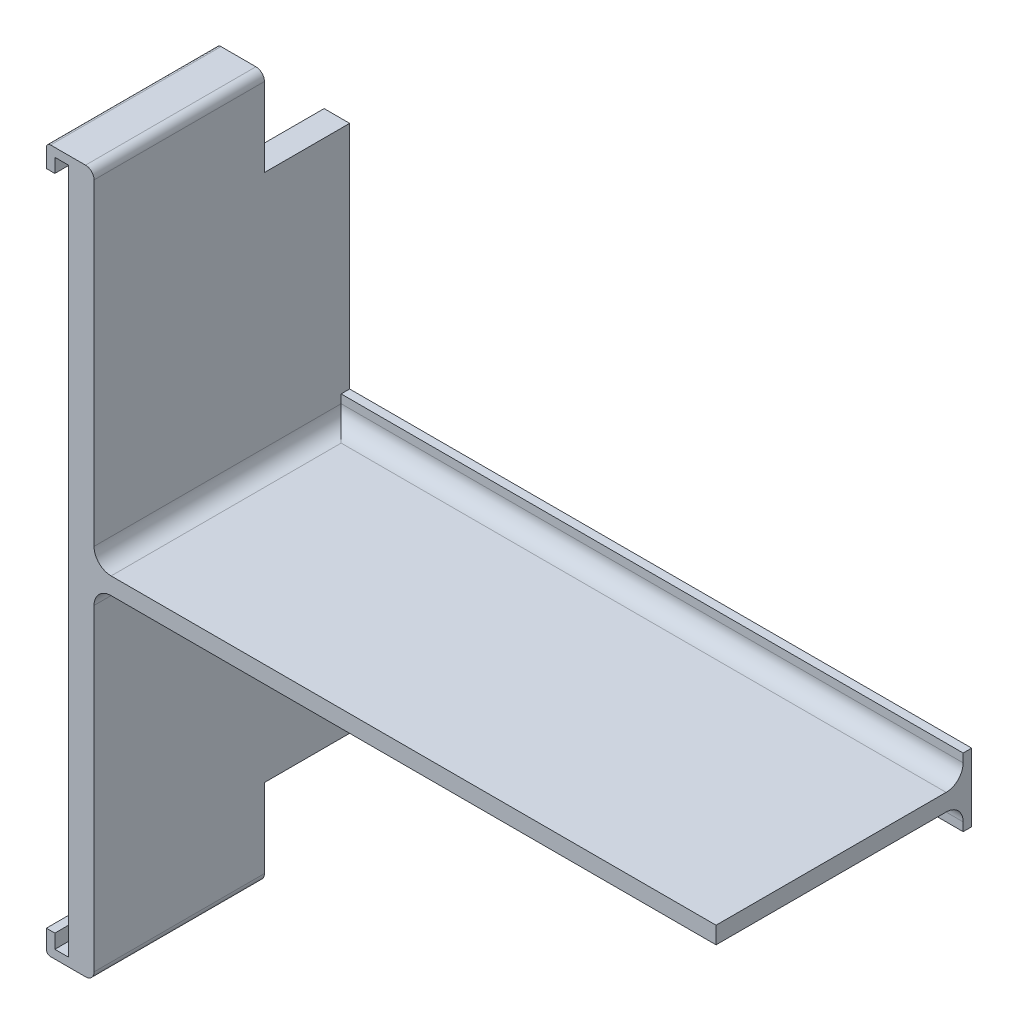
ISO-10303-21;
HEADER;
FILE_DESCRIPTION(('STEP AP214'),'2;1');
FILE_NAME('part.step','',(''),(''),'','','');
FILE_SCHEMA(('AUTOMOTIVE_DESIGN { 1 0 10303 214 1 1 1 1 }'));
ENDSEC;
DATA;
#1=APPLICATION_CONTEXT('core data for automotive mechanical design processes');
#2=APPLICATION_PROTOCOL_DEFINITION('international standard','automotive_design',2000,#1);
#3=PRODUCT_CONTEXT('',#1,'mechanical');
#4=PRODUCT('Part','Part','',(#3));
#5=PRODUCT_RELATED_PRODUCT_CATEGORY('part','',(#4));
#6=PRODUCT_DEFINITION_FORMATION('','',#4);
#7=PRODUCT_DEFINITION_CONTEXT('part definition',#1,'design');
#8=PRODUCT_DEFINITION('design','',#6,#7);
#9=PRODUCT_DEFINITION_SHAPE('','',#8);
#10=(LENGTH_UNIT() NAMED_UNIT(*) SI_UNIT(.MILLI.,.METRE.));
#11=(NAMED_UNIT(*) PLANE_ANGLE_UNIT() SI_UNIT($,.RADIAN.));
#12=(NAMED_UNIT(*) SI_UNIT($,.STERADIAN.) SOLID_ANGLE_UNIT());
#13=UNCERTAINTY_MEASURE_WITH_UNIT(LENGTH_MEASURE(1.E-05),#10,'distance_accuracy_value','');
#14=(GEOMETRIC_REPRESENTATION_CONTEXT(3) GLOBAL_UNCERTAINTY_ASSIGNED_CONTEXT((#13)) GLOBAL_UNIT_ASSIGNED_CONTEXT((#10,
#11,#12)) REPRESENTATION_CONTEXT('',''));
#15=CARTESIAN_POINT('',(0.,0.,0.));
#16=DIRECTION('',(0.,0.,1.));
#17=DIRECTION('',(1.,0.,0.));
#18=AXIS2_PLACEMENT_3D('',#15,#16,#17);
#19=CARTESIAN_POINT('',(0.8,1.,-10.));
#20=DIRECTION('',(0.,1.,0.));
#21=DIRECTION('',(0.,0.,1.));
#22=AXIS2_PLACEMENT_3D('',#19,#20,#21);
#23=PLANE('',#22);
#24=DIRECTION('',(0.,0.,1.));
#25=VECTOR('',#24,1.);
#26=CARTESIAN_POINT('',(76.8,1.,-10.));
#27=LINE('',#26,#25);
#28=CARTESIAN_POINT('',(76.8,1.,-7.));
#29=VERTEX_POINT('',#28);
#30=CARTESIAN_POINT('',(76.8,1.,20.));
#31=VERTEX_POINT('',#30);
#32=EDGE_CURVE('E329',#29,#31,#27,.T.);
#33=ORIENTED_EDGE('',*,*,#32,.F.);
#34=DIRECTION('',(-1.,0.,0.));
#35=VECTOR('',#34,1.);
#36=CARTESIAN_POINT('',(0.8,1.,-7.));
#37=LINE('',#36,#35);
#38=CARTESIAN_POINT('',(5.8,1.,-7.));
#39=VERTEX_POINT('',#38);
#40=EDGE_CURVE('E469',#29,#39,#37,.T.);
#41=ORIENTED_EDGE('',*,*,#40,.T.);
#42=DIRECTION('',(0.,0.,-1.));
#43=VECTOR('',#42,1.);
#44=CARTESIAN_POINT('',(5.8,1.,-10.));
#45=LINE('',#44,#43);
#46=CARTESIAN_POINT('',(5.8,1.,20.));
#47=VERTEX_POINT('',#46);
#48=EDGE_CURVE('E467',#39,#47,#45,.F.);
#49=ORIENTED_EDGE('',*,*,#48,.T.);
#50=DIRECTION('',(-1.,0.,0.));
#51=VECTOR('',#50,1.);
#52=CARTESIAN_POINT('',(0.8,1.,20.));
#53=LINE('',#52,#51);
#54=EDGE_CURVE('E321',#31,#47,#53,.T.);
#55=ORIENTED_EDGE('',*,*,#54,.F.);
#56=EDGE_LOOP('',(#33,#41,#49,#55));
#57=FACE_BOUND('',#56,.T.);
#58=ADVANCED_FACE('F43',(#57),#23,.T.);
#59=CARTESIAN_POINT('',(0.8,-1.,-10.));
#60=DIRECTION('',(0.,-1.,0.));
#61=DIRECTION('',(0.,0.,-1.));
#62=AXIS2_PLACEMENT_3D('',#59,#60,#61);
#63=PLANE('',#62);
#64=DIRECTION('',(1.,0.,0.));
#65=VECTOR('',#64,1.);
#66=CARTESIAN_POINT('',(0.8,-1.,20.));
#67=LINE('',#66,#65);
#68=CARTESIAN_POINT('',(5.8,-1.,20.));
#69=VERTEX_POINT('',#68);
#70=CARTESIAN_POINT('',(76.8,-1.,20.));
#71=VERTEX_POINT('',#70);
#72=EDGE_CURVE('E304',#69,#71,#67,.T.);
#73=ORIENTED_EDGE('',*,*,#72,.F.);
#74=DIRECTION('',(0.,0.,1.));
#75=VECTOR('',#74,1.);
#76=CARTESIAN_POINT('',(5.8,-1.,-10.));
#77=LINE('',#76,#75);
#78=CARTESIAN_POINT('',(5.8,-1.,-7.));
#79=VERTEX_POINT('',#78);
#80=EDGE_CURVE('E463',#69,#79,#77,.F.);
#81=ORIENTED_EDGE('',*,*,#80,.T.);
#82=DIRECTION('',(1.,0.,0.));
#83=VECTOR('',#82,1.);
#84=CARTESIAN_POINT('',(0.8,-1.,-7.));
#85=LINE('',#84,#83);
#86=CARTESIAN_POINT('',(76.8,-1.,-7.));
#87=VERTEX_POINT('',#86);
#88=EDGE_CURVE('E461',#79,#87,#85,.T.);
#89=ORIENTED_EDGE('',*,*,#88,.T.);
#90=DIRECTION('',(0.,0.,1.));
#91=VECTOR('',#90,1.);
#92=CARTESIAN_POINT('',(76.8,-1.,-10.));
#93=LINE('',#92,#91);
#94=EDGE_CURVE('E323',#87,#71,#93,.T.);
#95=ORIENTED_EDGE('',*,*,#94,.T.);
#96=EDGE_LOOP('',(#73,#81,#89,#95));
#97=FACE_BOUND('',#96,.T.);
#98=ADVANCED_FACE('F497',(#97),#63,.T.);
#99=CARTESIAN_POINT('',(0.,0.,0.));
#100=DIRECTION('',(0.,0.,1.));
#101=DIRECTION('',(1.,0.,0.));
#102=AXIS2_PLACEMENT_3D('',#99,#100,#101);
#103=PLANE('',#102);
#104=DIRECTION('',(1.,0.,0.));
#105=VECTOR('',#104,1.);
#106=CARTESIAN_POINT('',(0.8,31.,0.));
#107=LINE('',#106,#105);
#108=CARTESIAN_POINT('',(0.8,31.,0.));
#109=VERTEX_POINT('',#108);
#110=CARTESIAN_POINT('',(3.8,31.,0.));
#111=VERTEX_POINT('',#110);
#112=EDGE_CURVE('E296',#109,#111,#107,.T.);
#113=ORIENTED_EDGE('',*,*,#112,.F.);
#114=DIRECTION('',(0.,1.,0.));
#115=VECTOR('',#114,1.);
#116=CARTESIAN_POINT('',(0.8,0.,0.));
#117=LINE('',#116,#115);
#118=CARTESIAN_POINT('',(0.8,40.25,0.));
#119=VERTEX_POINT('',#118);
#120=EDGE_CURVE('E376',#109,#119,#117,.T.);
#121=ORIENTED_EDGE('',*,*,#120,.T.);
#122=DIRECTION('',(-1.,0.,0.));
#123=VECTOR('',#122,1.);
#124=CARTESIAN_POINT('',(0.,40.25,0.));
#125=LINE('',#124,#123);
#126=CARTESIAN_POINT('',(-0.8,40.25,0.));
#127=VERTEX_POINT('',#126);
#128=EDGE_CURVE('E373',#119,#127,#125,.T.);
#129=ORIENTED_EDGE('',*,*,#128,.T.);
#130=DIRECTION('',(0.,1.,0.));
#131=VECTOR('',#130,1.);
#132=CARTESIAN_POINT('',(-0.8,0.,0.));
#133=LINE('',#132,#131);
#134=CARTESIAN_POINT('',(-0.8,38.6034755324663,0.));
#135=VERTEX_POINT('',#134);
#136=EDGE_CURVE('E370',#135,#127,#133,.T.);
#137=ORIENTED_EDGE('',*,*,#136,.F.);
#138=DIRECTION('',(1.,0.,0.));
#139=VECTOR('',#138,1.);
#140=CARTESIAN_POINT('',(0.,38.6034755324663,0.));
#141=LINE('',#140,#139);
#142=CARTESIAN_POINT('',(-1.8,38.6034755324663,0.));
#143=VERTEX_POINT('',#142);
#144=EDGE_CURVE('E331',#143,#135,#141,.T.);
#145=ORIENTED_EDGE('',*,*,#144,.F.);
#146=DIRECTION('',(0.,1.,0.));
#147=VECTOR('',#146,1.);
#148=CARTESIAN_POINT('',(-1.80000000000001,0.,0.));
#149=LINE('',#148,#147);
#150=CARTESIAN_POINT('',(-1.8,40.75,0.));
#151=VERTEX_POINT('',#150);
#152=EDGE_CURVE('E338',#143,#151,#149,.T.);
#153=ORIENTED_EDGE('',*,*,#152,.T.);
#154=CARTESIAN_POINT('',(-1.3,40.75,0.));
#155=DIRECTION('',(0.,0.,1.));
#156=DIRECTION('',(1.,0.,0.));
#157=AXIS2_PLACEMENT_3D('',#154,#155,#156);
#158=CIRCLE('',#157,0.5);
#159=CARTESIAN_POINT('',(-1.3,41.25,0.));
#160=VERTEX_POINT('',#159);
#161=EDGE_CURVE('E443',#151,#160,#158,.F.);
#162=ORIENTED_EDGE('',*,*,#161,.T.);
#163=DIRECTION('',(-1.,0.,0.));
#164=VECTOR('',#163,1.);
#165=CARTESIAN_POINT('',(0.,41.25,0.));
#166=LINE('',#165,#164);
#167=CARTESIAN_POINT('',(2.8,41.25,0.));
#168=VERTEX_POINT('',#167);
#169=EDGE_CURVE('E396',#168,#160,#166,.T.);
#170=ORIENTED_EDGE('',*,*,#169,.F.);
#171=CARTESIAN_POINT('',(2.8,40.25,0.));
#172=DIRECTION('',(0.,0.,1.));
#173=DIRECTION('',(1.,0.,0.));
#174=AXIS2_PLACEMENT_3D('',#171,#172,#173);
#175=CIRCLE('',#174,1.);
#176=CARTESIAN_POINT('',(3.8,40.25,0.));
#177=VERTEX_POINT('',#176);
#178=EDGE_CURVE('E423',#168,#177,#175,.F.);
#179=ORIENTED_EDGE('',*,*,#178,.T.);
#180=DIRECTION('',(0.,1.,0.));
#181=VECTOR('',#180,1.);
#182=CARTESIAN_POINT('',(3.8,0.,0.));
#183=LINE('',#182,#181);
#184=EDGE_CURVE('E392',#111,#177,#183,.T.);
#185=ORIENTED_EDGE('',*,*,#184,.F.);
#186=EDGE_LOOP('',(#113,#121,#129,#137,#145,#153,#162,#170,#179,#185));
#187=FACE_BOUND('',#186,.T.);
#188=ADVANCED_FACE('F584',(#187),#103,.F.);
#189=DIRECTION('',(-1.,0.,0.));
#190=VECTOR('',#189,1.);
#191=CARTESIAN_POINT('',(0.8,-31.,0.));
#192=LINE('',#191,#190);
#193=CARTESIAN_POINT('',(3.8,-31.,0.));
#194=VERTEX_POINT('',#193);
#195=CARTESIAN_POINT('',(0.8,-31.,0.));
#196=VERTEX_POINT('',#195);
#197=EDGE_CURVE('E291',#194,#196,#192,.T.);
#198=ORIENTED_EDGE('',*,*,#197,.F.);
#199=CARTESIAN_POINT('',(3.8,-40.25,0.));
#200=VERTEX_POINT('',#199);
#201=EDGE_CURVE('E393',#200,#194,#183,.T.);
#202=ORIENTED_EDGE('',*,*,#201,.F.);
#203=CARTESIAN_POINT('',(2.8,-40.25,0.));
#204=DIRECTION('',(0.,0.,1.));
#205=DIRECTION('',(1.,0.,0.));
#206=AXIS2_PLACEMENT_3D('',#203,#204,#205);
#207=CIRCLE('',#206,1.);
#208=CARTESIAN_POINT('',(2.8,-41.25,0.));
#209=VERTEX_POINT('',#208);
#210=EDGE_CURVE('E436',#200,#209,#207,.F.);
#211=ORIENTED_EDGE('',*,*,#210,.T.);
#212=DIRECTION('',(-1.,0.,0.));
#213=VECTOR('',#212,1.);
#214=CARTESIAN_POINT('',(0.,-41.25,0.));
#215=LINE('',#214,#213);
#216=CARTESIAN_POINT('',(-1.3,-41.25,0.));
#217=VERTEX_POINT('',#216);
#218=EDGE_CURVE('E389',#209,#217,#215,.T.);
#219=ORIENTED_EDGE('',*,*,#218,.T.);
#220=CARTESIAN_POINT('',(-1.3,-40.75,0.));
#221=DIRECTION('',(0.,0.,1.));
#222=DIRECTION('',(1.,0.,0.));
#223=AXIS2_PLACEMENT_3D('',#220,#221,#222);
#224=CIRCLE('',#223,0.5);
#225=CARTESIAN_POINT('',(-1.8,-40.75,0.));
#226=VERTEX_POINT('',#225);
#227=EDGE_CURVE('E454',#217,#226,#224,.F.);
#228=ORIENTED_EDGE('',*,*,#227,.T.);
#229=DIRECTION('',(0.,1.,0.));
#230=VECTOR('',#229,1.);
#231=CARTESIAN_POINT('',(-1.80000000000001,0.,0.));
#232=LINE('',#231,#230);
#233=CARTESIAN_POINT('',(-1.8,-38.6034755324663,0.));
#234=VERTEX_POINT('',#233);
#235=EDGE_CURVE('E387',#226,#234,#232,.T.);
#236=ORIENTED_EDGE('',*,*,#235,.T.);
#237=DIRECTION('',(1.,0.,0.));
#238=VECTOR('',#237,1.);
#239=CARTESIAN_POINT('',(0.,-38.6034755324663,0.));
#240=LINE('',#239,#238);
#241=CARTESIAN_POINT('',(-0.8,-38.6034755324663,0.));
#242=VERTEX_POINT('',#241);
#243=EDGE_CURVE('E384',#234,#242,#240,.T.);
#244=ORIENTED_EDGE('',*,*,#243,.T.);
#245=DIRECTION('',(0.,1.,0.));
#246=VECTOR('',#245,1.);
#247=CARTESIAN_POINT('',(-0.8,0.,0.));
#248=LINE('',#247,#246);
#249=CARTESIAN_POINT('',(-0.8,-40.25,0.));
#250=VERTEX_POINT('',#249);
#251=EDGE_CURVE('E381',#250,#242,#248,.T.);
#252=ORIENTED_EDGE('',*,*,#251,.F.);
#253=DIRECTION('',(-1.,0.,0.));
#254=VECTOR('',#253,1.);
#255=CARTESIAN_POINT('',(0.,-40.25,0.));
#256=LINE('',#255,#254);
#257=CARTESIAN_POINT('',(0.8,-40.25,0.));
#258=VERTEX_POINT('',#257);
#259=EDGE_CURVE('E379',#258,#250,#256,.T.);
#260=ORIENTED_EDGE('',*,*,#259,.F.);
#261=EDGE_CURVE('E377',#258,#196,#117,.T.);
#262=ORIENTED_EDGE('',*,*,#261,.T.);
#263=EDGE_LOOP('',(#198,#202,#211,#219,#228,#236,#244,#252,#260,#262));
#264=FACE_BOUND('',#263,.T.);
#265=ADVANCED_FACE('F536',(#264),#103,.F.);
#266=CARTESIAN_POINT('',(3.8,0.,20.));
#267=DIRECTION('',(-1.,0.,0.));
#268=DIRECTION('',(0.,0.,1.));
#269=AXIS2_PLACEMENT_3D('',#266,#267,#268);
#270=PLANE('',#269);
#271=DIRECTION('',(0.,1.,0.));
#272=VECTOR('',#271,1.);
#273=CARTESIAN_POINT('',(3.8,0.,20.));
#274=LINE('',#273,#272);
#275=CARTESIAN_POINT('',(3.8,3.,20.));
#276=VERTEX_POINT('',#275);
#277=CARTESIAN_POINT('',(3.8,40.25,20.));
#278=VERTEX_POINT('',#277);
#279=EDGE_CURVE('E357',#276,#278,#274,.T.);
#280=ORIENTED_EDGE('',*,*,#279,.F.);
#281=DIRECTION('',(0.,0.,-1.));
#282=VECTOR('',#281,1.);
#283=CARTESIAN_POINT('',(3.8,3.,20.));
#284=LINE('',#283,#282);
#285=CARTESIAN_POINT('',(3.8,3.,-9.));
#286=VERTEX_POINT('',#285);
#287=EDGE_CURVE('E65',#276,#286,#284,.T.);
#288=ORIENTED_EDGE('',*,*,#287,.T.);
#289=DIRECTION('',(0.,-1.,0.));
#290=VECTOR('',#289,1.);
#291=CARTESIAN_POINT('',(3.8,0.,-9.));
#292=LINE('',#291,#290);
#293=CARTESIAN_POINT('',(3.8,4.,-9.));
#294=VERTEX_POINT('',#293);
#295=EDGE_CURVE('E288',#294,#286,#292,.T.);
#296=ORIENTED_EDGE('',*,*,#295,.F.);
#297=DIRECTION('',(0.,0.,-1.));
#298=VECTOR('',#297,1.);
#299=CARTESIAN_POINT('',(3.8,4.,20.));
#300=LINE('',#299,#298);
#301=CARTESIAN_POINT('',(3.8,4.,-10.));
#302=VERTEX_POINT('',#301);
#303=EDGE_CURVE('E253',#294,#302,#300,.T.);
#304=ORIENTED_EDGE('',*,*,#303,.T.);
#305=DIRECTION('',(0.,-1.,0.));
#306=VECTOR('',#305,1.);
#307=CARTESIAN_POINT('',(3.8,31.,-9.99999999999999));
#308=LINE('',#307,#306);
#309=CARTESIAN_POINT('',(3.8,31.,-9.99999999999999));
#310=VERTEX_POINT('',#309);
#311=EDGE_CURVE('E301',#310,#302,#308,.T.);
#312=ORIENTED_EDGE('',*,*,#311,.F.);
#313=DIRECTION('',(0.,0.,1.));
#314=VECTOR('',#313,1.);
#315=CARTESIAN_POINT('',(3.8,31.,-72.072538211354));
#316=LINE('',#315,#314);
#317=EDGE_CURVE('E299',#310,#111,#316,.T.);
#318=ORIENTED_EDGE('',*,*,#317,.T.);
#319=ORIENTED_EDGE('',*,*,#184,.T.);
#320=DIRECTION('',(0.,0.,-1.));
#321=VECTOR('',#320,1.);
#322=CARTESIAN_POINT('',(3.8,40.25,20.));
#323=LINE('',#322,#321);
#324=EDGE_CURVE('E426',#177,#278,#323,.F.);
#325=ORIENTED_EDGE('',*,*,#324,.T.);
#326=EDGE_LOOP('',(#280,#288,#296,#304,#312,#318,#319,#325));
#327=FACE_BOUND('',#326,.T.);
#328=ADVANCED_FACE('F520',(#327),#270,.F.);
#329=CARTESIAN_POINT('',(0.,38.6034755324663,20.));
#330=DIRECTION('',(0.,1.,0.));
#331=DIRECTION('',(0.,0.,1.));
#332=AXIS2_PLACEMENT_3D('',#329,#330,#331);
#333=PLANE('',#332);
#334=ORIENTED_EDGE('',*,*,#144,.T.);
#335=DIRECTION('',(0.,0.,-1.));
#336=VECTOR('',#335,1.);
#337=CARTESIAN_POINT('',(-0.8,38.6034755324663,20.));
#338=LINE('',#337,#336);
#339=CARTESIAN_POINT('',(-0.8,38.6034755324663,20.));
#340=VERTEX_POINT('',#339);
#341=EDGE_CURVE('E417',#340,#135,#338,.T.);
#342=ORIENTED_EDGE('',*,*,#341,.F.);
#343=DIRECTION('',(1.,0.,0.));
#344=VECTOR('',#343,1.);
#345=CARTESIAN_POINT('',(0.,38.6034755324663,20.));
#346=LINE('',#345,#344);
#347=CARTESIAN_POINT('',(-1.8,38.6034755324663,20.));
#348=VERTEX_POINT('',#347);
#349=EDGE_CURVE('E334',#348,#340,#346,.T.);
#350=ORIENTED_EDGE('',*,*,#349,.F.);
#351=DIRECTION('',(0.,0.,-1.));
#352=VECTOR('',#351,1.);
#353=CARTESIAN_POINT('',(-1.8,38.6034755324663,20.));
#354=LINE('',#353,#352);
#355=EDGE_CURVE('E367',#348,#143,#354,.T.);
#356=ORIENTED_EDGE('',*,*,#355,.T.);
#357=EDGE_LOOP('',(#334,#342,#350,#356));
#358=FACE_BOUND('',#357,.T.);
#359=ADVANCED_FACE('F603',(#358),#333,.F.);
#360=CARTESIAN_POINT('',(-0.8,0.,20.));
#361=DIRECTION('',(-1.,0.,0.));
#362=DIRECTION('',(0.,0.,1.));
#363=AXIS2_PLACEMENT_3D('',#360,#361,#362);
#364=PLANE('',#363);
#365=ORIENTED_EDGE('',*,*,#136,.T.);
#366=DIRECTION('',(0.,0.,-1.));
#367=VECTOR('',#366,1.);
#368=CARTESIAN_POINT('',(-0.8,40.25,20.));
#369=LINE('',#368,#367);
#370=CARTESIAN_POINT('',(-0.8,40.25,20.));
#371=VERTEX_POINT('',#370);
#372=EDGE_CURVE('E415',#371,#127,#369,.T.);
#373=ORIENTED_EDGE('',*,*,#372,.F.);
#374=DIRECTION('',(0.,1.,0.));
#375=VECTOR('',#374,1.);
#376=CARTESIAN_POINT('',(-0.8,0.,20.));
#377=LINE('',#376,#375);
#378=EDGE_CURVE('E337',#340,#371,#377,.T.);
#379=ORIENTED_EDGE('',*,*,#378,.F.);
#380=ORIENTED_EDGE('',*,*,#341,.T.);
#381=EDGE_LOOP('',(#365,#373,#379,#380));
#382=FACE_BOUND('',#381,.T.);
#383=ADVANCED_FACE('F581',(#382),#364,.F.);
#384=CARTESIAN_POINT('',(0.,40.25,20.));
#385=DIRECTION('',(0.,-1.,0.));
#386=DIRECTION('',(0.,0.,-1.));
#387=AXIS2_PLACEMENT_3D('',#384,#385,#386);
#388=PLANE('',#387);
#389=ORIENTED_EDGE('',*,*,#128,.F.);
#390=DIRECTION('',(0.,0.,-1.));
#391=VECTOR('',#390,1.);
#392=CARTESIAN_POINT('',(0.8,40.25,20.));
#393=LINE('',#392,#391);
#394=CARTESIAN_POINT('',(0.8,40.25,20.));
#395=VERTEX_POINT('',#394);
#396=EDGE_CURVE('E412',#395,#119,#393,.T.);
#397=ORIENTED_EDGE('',*,*,#396,.F.);
#398=DIRECTION('',(-1.,0.,0.));
#399=VECTOR('',#398,1.);
#400=CARTESIAN_POINT('',(0.,40.25,20.));
#401=LINE('',#400,#399);
#402=EDGE_CURVE('E340',#395,#371,#401,.T.);
#403=ORIENTED_EDGE('',*,*,#402,.T.);
#404=ORIENTED_EDGE('',*,*,#372,.T.);
#405=EDGE_LOOP('',(#389,#397,#403,#404));
#406=FACE_BOUND('',#405,.T.);
#407=ADVANCED_FACE('F575',(#406),#388,.T.);
#408=CARTESIAN_POINT('',(0.8,0.,20.));
#409=DIRECTION('',(-1.,0.,0.));
#410=DIRECTION('',(0.,0.,1.));
#411=AXIS2_PLACEMENT_3D('',#408,#409,#410);
#412=PLANE('',#411);
#413=DIRECTION('',(0.,-1.,0.));
#414=VECTOR('',#413,1.);
#415=CARTESIAN_POINT('',(0.8,-1.,-10.));
#416=LINE('',#415,#414);
#417=CARTESIAN_POINT('',(0.8,31.,-9.99999999999999));
#418=VERTEX_POINT('',#417);
#419=CARTESIAN_POINT('',(0.8,-31.,-9.99999999999999));
#420=VERTEX_POINT('',#419);
#421=EDGE_CURVE('E319',#418,#420,#416,.T.);
#422=ORIENTED_EDGE('',*,*,#421,.T.);
#423=DIRECTION('',(0.,0.,1.));
#424=VECTOR('',#423,1.);
#425=CARTESIAN_POINT('',(0.8,-31.,-72.072538211354));
#426=LINE('',#425,#424);
#427=EDGE_CURVE('E290',#420,#196,#426,.T.);
#428=ORIENTED_EDGE('',*,*,#427,.T.);
#429=ORIENTED_EDGE('',*,*,#261,.F.);
#430=DIRECTION('',(0.,0.,-1.));
#431=VECTOR('',#430,1.);
#432=CARTESIAN_POINT('',(0.8,-40.25,20.));
#433=LINE('',#432,#431);
#434=CARTESIAN_POINT('',(0.8,-40.25,20.));
#435=VERTEX_POINT('',#434);
#436=EDGE_CURVE('E410',#435,#258,#433,.T.);
#437=ORIENTED_EDGE('',*,*,#436,.F.);
#438=DIRECTION('',(0.,1.,0.));
#439=VECTOR('',#438,1.);
#440=CARTESIAN_POINT('',(0.8,0.,20.));
#441=LINE('',#440,#439);
#442=EDGE_CURVE('E343',#435,#395,#441,.T.);
#443=ORIENTED_EDGE('',*,*,#442,.T.);
#444=ORIENTED_EDGE('',*,*,#396,.T.);
#445=ORIENTED_EDGE('',*,*,#120,.F.);
#446=DIRECTION('',(0.,0.,1.));
#447=VECTOR('',#446,1.);
#448=CARTESIAN_POINT('',(0.8,31.,-72.072538211354));
#449=LINE('',#448,#447);
#450=EDGE_CURVE('E300',#418,#109,#449,.T.);
#451=ORIENTED_EDGE('',*,*,#450,.F.);
#452=EDGE_LOOP('',(#422,#428,#429,#437,#443,#444,#445,#451));
#453=FACE_BOUND('',#452,.T.);
#454=ADVANCED_FACE('F529',(#453),#412,.T.);
#455=CARTESIAN_POINT('',(0.,-40.25,20.));
#456=DIRECTION('',(0.,-1.,0.));
#457=DIRECTION('',(0.,0.,-1.));
#458=AXIS2_PLACEMENT_3D('',#455,#456,#457);
#459=PLANE('',#458);
#460=ORIENTED_EDGE('',*,*,#259,.T.);
#461=DIRECTION('',(0.,0.,-1.));
#462=VECTOR('',#461,1.);
#463=CARTESIAN_POINT('',(-0.8,-40.25,20.));
#464=LINE('',#463,#462);
#465=CARTESIAN_POINT('',(-0.8,-40.25,20.));
#466=VERTEX_POINT('',#465);
#467=EDGE_CURVE('E407',#466,#250,#464,.T.);
#468=ORIENTED_EDGE('',*,*,#467,.F.);
#469=DIRECTION('',(-1.,0.,0.));
#470=VECTOR('',#469,1.);
#471=CARTESIAN_POINT('',(0.,-40.25,20.));
#472=LINE('',#471,#470);
#473=EDGE_CURVE('E345',#435,#466,#472,.T.);
#474=ORIENTED_EDGE('',*,*,#473,.F.);
#475=ORIENTED_EDGE('',*,*,#436,.T.);
#476=EDGE_LOOP('',(#460,#468,#474,#475));
#477=FACE_BOUND('',#476,.T.);
#478=ADVANCED_FACE('F569',(#477),#459,.F.);
#479=CARTESIAN_POINT('',(-0.8,0.,20.));
#480=DIRECTION('',(-1.,0.,0.));
#481=DIRECTION('',(0.,0.,1.));
#482=AXIS2_PLACEMENT_3D('',#479,#480,#481);
#483=PLANE('',#482);
#484=ORIENTED_EDGE('',*,*,#251,.T.);
#485=DIRECTION('',(0.,0.,-1.));
#486=VECTOR('',#485,1.);
#487=CARTESIAN_POINT('',(-0.8,-38.6034755324663,20.));
#488=LINE('',#487,#486);
#489=CARTESIAN_POINT('',(-0.8,-38.6034755324663,20.));
#490=VERTEX_POINT('',#489);
#491=EDGE_CURVE('E405',#490,#242,#488,.T.);
#492=ORIENTED_EDGE('',*,*,#491,.F.);
#493=DIRECTION('',(0.,1.,0.));
#494=VECTOR('',#493,1.);
#495=CARTESIAN_POINT('',(-0.8,0.,20.));
#496=LINE('',#495,#494);
#497=EDGE_CURVE('E347',#466,#490,#496,.T.);
#498=ORIENTED_EDGE('',*,*,#497,.F.);
#499=ORIENTED_EDGE('',*,*,#467,.T.);
#500=EDGE_LOOP('',(#484,#492,#498,#499));
#501=FACE_BOUND('',#500,.T.);
#502=ADVANCED_FACE('F564',(#501),#483,.F.);
#503=CARTESIAN_POINT('',(0.,-38.6034755324663,20.));
#504=DIRECTION('',(0.,1.,0.));
#505=DIRECTION('',(0.,0.,1.));
#506=AXIS2_PLACEMENT_3D('',#503,#504,#505);
#507=PLANE('',#506);
#508=ORIENTED_EDGE('',*,*,#243,.F.);
#509=DIRECTION('',(0.,0.,-1.));
#510=VECTOR('',#509,1.);
#511=CARTESIAN_POINT('',(-1.8,-38.6034755324663,20.));
#512=LINE('',#511,#510);
#513=CARTESIAN_POINT('',(-1.8,-38.6034755324663,20.));
#514=VERTEX_POINT('',#513);
#515=EDGE_CURVE('E402',#514,#234,#512,.T.);
#516=ORIENTED_EDGE('',*,*,#515,.F.);
#517=DIRECTION('',(1.,0.,0.));
#518=VECTOR('',#517,1.);
#519=CARTESIAN_POINT('',(0.,-38.6034755324663,20.));
#520=LINE('',#519,#518);
#521=EDGE_CURVE('E349',#514,#490,#520,.T.);
#522=ORIENTED_EDGE('',*,*,#521,.T.);
#523=ORIENTED_EDGE('',*,*,#491,.T.);
#524=EDGE_LOOP('',(#508,#516,#522,#523));
#525=FACE_BOUND('',#524,.T.);
#526=ADVANCED_FACE('F560',(#525),#507,.T.);
#527=CARTESIAN_POINT('',(-1.80000000000001,0.,20.));
#528=DIRECTION('',(-1.,0.,0.));
#529=DIRECTION('',(0.,-1.,0.));
#530=AXIS2_PLACEMENT_3D('',#527,#528,#529);
#531=PLANE('',#530);
#532=ORIENTED_EDGE('',*,*,#235,.F.);
#533=DIRECTION('',(0.,0.,-1.));
#534=VECTOR('',#533,1.);
#535=CARTESIAN_POINT('',(-1.8,-40.75,20.));
#536=LINE('',#535,#534);
#537=CARTESIAN_POINT('',(-1.8,-40.75,20.));
#538=VERTEX_POINT('',#537);
#539=EDGE_CURVE('E456',#226,#538,#536,.F.);
#540=ORIENTED_EDGE('',*,*,#539,.T.);
#541=DIRECTION('',(0.,1.,0.));
#542=VECTOR('',#541,1.);
#543=CARTESIAN_POINT('',(-1.80000000000001,0.,20.));
#544=LINE('',#543,#542);
#545=EDGE_CURVE('E352',#538,#514,#544,.T.);
#546=ORIENTED_EDGE('',*,*,#545,.T.);
#547=ORIENTED_EDGE('',*,*,#515,.T.);
#548=EDGE_LOOP('',(#532,#540,#546,#547));
#549=FACE_BOUND('',#548,.T.);
#550=ADVANCED_FACE('F554',(#549),#531,.T.);
#551=CARTESIAN_POINT('',(0.,-41.25,20.));
#552=DIRECTION('',(0.,-1.,0.));
#553=DIRECTION('',(0.,0.,-1.));
#554=AXIS2_PLACEMENT_3D('',#551,#552,#553);
#555=PLANE('',#554);
#556=DIRECTION('',(-1.,0.,0.));
#557=VECTOR('',#556,1.);
#558=CARTESIAN_POINT('',(0.,-41.25,20.));
#559=LINE('',#558,#557);
#560=CARTESIAN_POINT('',(2.8,-41.25,20.));
#561=VERTEX_POINT('',#560);
#562=CARTESIAN_POINT('',(-1.3,-41.25,20.));
#563=VERTEX_POINT('',#562);
#564=EDGE_CURVE('E354',#561,#563,#559,.T.);
#565=ORIENTED_EDGE('',*,*,#564,.T.);
#566=DIRECTION('',(0.,0.,-1.));
#567=VECTOR('',#566,1.);
#568=CARTESIAN_POINT('',(-1.3,-41.25,20.));
#569=LINE('',#568,#567);
#570=EDGE_CURVE('E451',#563,#217,#569,.T.);
#571=ORIENTED_EDGE('',*,*,#570,.T.);
#572=ORIENTED_EDGE('',*,*,#218,.F.);
#573=DIRECTION('',(0.,0.,-1.));
#574=VECTOR('',#573,1.);
#575=CARTESIAN_POINT('',(2.8,-41.25,20.));
#576=LINE('',#575,#574);
#577=EDGE_CURVE('E438',#209,#561,#576,.F.);
#578=ORIENTED_EDGE('',*,*,#577,.T.);
#579=EDGE_LOOP('',(#565,#571,#572,#578));
#580=FACE_BOUND('',#579,.T.);
#581=ADVANCED_FACE('F545',(#580),#555,.T.);
#582=DIRECTION('',(0.,-1.,0.));
#583=VECTOR('',#582,1.);
#584=CARTESIAN_POINT('',(3.8,0.,-9.));
#585=LINE('',#584,#583);
#586=CARTESIAN_POINT('',(3.8,-3.,-9.));
#587=VERTEX_POINT('',#586);
#588=CARTESIAN_POINT('',(3.8,-4.,-9.));
#589=VERTEX_POINT('',#588);
#590=EDGE_CURVE('E286',#587,#589,#585,.T.);
#591=ORIENTED_EDGE('',*,*,#590,.F.);
#592=DIRECTION('',(0.,0.,1.));
#593=VECTOR('',#592,1.);
#594=CARTESIAN_POINT('',(3.8,-3.,20.));
#595=LINE('',#594,#593);
#596=CARTESIAN_POINT('',(3.8,-3.,20.));
#597=VERTEX_POINT('',#596);
#598=EDGE_CURVE('E458',#587,#597,#595,.T.);
#599=ORIENTED_EDGE('',*,*,#598,.T.);
#600=CARTESIAN_POINT('',(3.8,-40.25,20.));
#601=VERTEX_POINT('',#600);
#602=EDGE_CURVE('E358',#601,#597,#274,.T.);
#603=ORIENTED_EDGE('',*,*,#602,.F.);
#604=DIRECTION('',(0.,0.,-1.));
#605=VECTOR('',#604,1.);
#606=CARTESIAN_POINT('',(3.8,-40.25,0.));
#607=LINE('',#606,#605);
#608=EDGE_CURVE('E433',#601,#200,#607,.T.);
#609=ORIENTED_EDGE('',*,*,#608,.T.);
#610=ORIENTED_EDGE('',*,*,#201,.T.);
#611=DIRECTION('',(0.,0.,1.));
#612=VECTOR('',#611,1.);
#613=CARTESIAN_POINT('',(3.8,-31.,-72.072538211354));
#614=LINE('',#613,#612);
#615=CARTESIAN_POINT('',(3.8,-31.,-9.99999999999999));
#616=VERTEX_POINT('',#615);
#617=EDGE_CURVE('E295',#616,#194,#614,.T.);
#618=ORIENTED_EDGE('',*,*,#617,.F.);
#619=CARTESIAN_POINT('',(3.8,-4.,-9.99999999999999));
#620=VERTEX_POINT('',#619);
#621=EDGE_CURVE('E305',#620,#616,#308,.T.);
#622=ORIENTED_EDGE('',*,*,#621,.F.);
#623=DIRECTION('',(0.,0.,1.));
#624=VECTOR('',#623,1.);
#625=CARTESIAN_POINT('',(3.8,-4.,20.));
#626=LINE('',#625,#624);
#627=EDGE_CURVE('E283',#620,#589,#626,.T.);
#628=ORIENTED_EDGE('',*,*,#627,.T.);
#629=EDGE_LOOP('',(#591,#599,#603,#609,#610,#618,#622,#628));
#630=FACE_BOUND('',#629,.T.);
#631=ADVANCED_FACE('F509',(#630),#270,.F.);
#632=CARTESIAN_POINT('',(0.,41.25,20.));
#633=DIRECTION('',(0.,-1.,0.));
#634=DIRECTION('',(0.,0.,-1.));
#635=AXIS2_PLACEMENT_3D('',#632,#633,#634);
#636=PLANE('',#635);
#637=ORIENTED_EDGE('',*,*,#169,.T.);
#638=DIRECTION('',(0.,0.,-1.));
#639=VECTOR('',#638,1.);
#640=CARTESIAN_POINT('',(-1.3,41.25,20.));
#641=LINE('',#640,#639);
#642=CARTESIAN_POINT('',(-1.3,41.25,20.));
#643=VERTEX_POINT('',#642);
#644=EDGE_CURVE('E445',#160,#643,#641,.F.);
#645=ORIENTED_EDGE('',*,*,#644,.T.);
#646=DIRECTION('',(-1.,0.,0.));
#647=VECTOR('',#646,1.);
#648=CARTESIAN_POINT('',(0.,41.25,20.));
#649=LINE('',#648,#647);
#650=CARTESIAN_POINT('',(2.8,41.25,20.));
#651=VERTEX_POINT('',#650);
#652=EDGE_CURVE('E361',#651,#643,#649,.T.);
#653=ORIENTED_EDGE('',*,*,#652,.F.);
#654=DIRECTION('',(0.,0.,-1.));
#655=VECTOR('',#654,1.);
#656=CARTESIAN_POINT('',(2.8,41.25,20.));
#657=LINE('',#656,#655);
#658=EDGE_CURVE('E420',#651,#168,#657,.T.);
#659=ORIENTED_EDGE('',*,*,#658,.T.);
#660=EDGE_LOOP('',(#637,#645,#653,#659));
#661=FACE_BOUND('',#660,.T.);
#662=ADVANCED_FACE('F594',(#661),#636,.F.);
#663=CARTESIAN_POINT('',(-1.80000000000001,0.,20.));
#664=DIRECTION('',(-1.,0.,0.));
#665=DIRECTION('',(0.,-1.,0.));
#666=AXIS2_PLACEMENT_3D('',#663,#664,#665);
#667=PLANE('',#666);
#668=DIRECTION('',(0.,1.,0.));
#669=VECTOR('',#668,1.);
#670=CARTESIAN_POINT('',(-1.80000000000001,0.,20.));
#671=LINE('',#670,#669);
#672=CARTESIAN_POINT('',(-1.8,40.75,20.));
#673=VERTEX_POINT('',#672);
#674=EDGE_CURVE('E364',#348,#673,#671,.T.);
#675=ORIENTED_EDGE('',*,*,#674,.T.);
#676=DIRECTION('',(0.,0.,-1.));
#677=VECTOR('',#676,1.);
#678=CARTESIAN_POINT('',(-1.8,40.75,0.));
#679=LINE('',#678,#677);
#680=EDGE_CURVE('E440',#673,#151,#679,.T.);
#681=ORIENTED_EDGE('',*,*,#680,.T.);
#682=ORIENTED_EDGE('',*,*,#152,.F.);
#683=ORIENTED_EDGE('',*,*,#355,.F.);
#684=EDGE_LOOP('',(#675,#681,#682,#683));
#685=FACE_BOUND('',#684,.T.);
#686=ADVANCED_FACE('F600',(#685),#667,.T.);
#687=CARTESIAN_POINT('',(0.,0.,20.));
#688=DIRECTION('',(0.,0.,1.));
#689=DIRECTION('',(1.,0.,0.));
#690=AXIS2_PLACEMENT_3D('',#687,#688,#689);
#691=PLANE('',#690);
#692=ORIENTED_EDGE('',*,*,#652,.T.);
#693=CARTESIAN_POINT('',(-1.3,40.75,20.));
#694=DIRECTION('',(0.,0.,1.));
#695=DIRECTION('',(1.,0.,0.));
#696=AXIS2_PLACEMENT_3D('',#693,#694,#695);
#697=CIRCLE('',#696,0.5);
#698=EDGE_CURVE('E449',#643,#673,#697,.T.);
#699=ORIENTED_EDGE('',*,*,#698,.T.);
#700=ORIENTED_EDGE('',*,*,#674,.F.);
#701=ORIENTED_EDGE('',*,*,#349,.T.);
#702=ORIENTED_EDGE('',*,*,#378,.T.);
#703=ORIENTED_EDGE('',*,*,#402,.F.);
#704=ORIENTED_EDGE('',*,*,#442,.F.);
#705=ORIENTED_EDGE('',*,*,#473,.T.);
#706=ORIENTED_EDGE('',*,*,#497,.T.);
#707=ORIENTED_EDGE('',*,*,#521,.F.);
#708=ORIENTED_EDGE('',*,*,#545,.F.);
#709=CARTESIAN_POINT('',(-1.3,-40.75,20.));
#710=DIRECTION('',(0.,0.,1.));
#711=DIRECTION('',(1.,0.,0.));
#712=AXIS2_PLACEMENT_3D('',#709,#710,#711);
#713=CIRCLE('',#712,0.5);
#714=EDGE_CURVE('E447',#538,#563,#713,.T.);
#715=ORIENTED_EDGE('',*,*,#714,.T.);
#716=ORIENTED_EDGE('',*,*,#564,.F.);
#717=CARTESIAN_POINT('',(2.8,-40.25,20.));
#718=DIRECTION('',(0.,0.,1.));
#719=DIRECTION('',(1.,0.,0.));
#720=AXIS2_PLACEMENT_3D('',#717,#718,#719);
#721=CIRCLE('',#720,1.);
#722=EDGE_CURVE('E429',#561,#601,#721,.T.);
#723=ORIENTED_EDGE('',*,*,#722,.T.);
#724=ORIENTED_EDGE('',*,*,#602,.T.);
#725=CARTESIAN_POINT('',(5.8,-3.,20.));
#726=DIRECTION('',(0.,0.,1.));
#727=DIRECTION('',(1.,0.,0.));
#728=AXIS2_PLACEMENT_3D('',#725,#726,#727);
#729=CIRCLE('',#728,2.);
#730=EDGE_CURVE('E474',#597,#69,#729,.F.);
#731=ORIENTED_EDGE('',*,*,#730,.T.);
#732=ORIENTED_EDGE('',*,*,#72,.T.);
#733=DIRECTION('',(0.,1.,0.));
#734=VECTOR('',#733,1.);
#735=CARTESIAN_POINT('',(76.8,-1.,20.));
#736=LINE('',#735,#734);
#737=EDGE_CURVE('E325',#71,#31,#736,.T.);
#738=ORIENTED_EDGE('',*,*,#737,.T.);
#739=ORIENTED_EDGE('',*,*,#54,.T.);
#740=CARTESIAN_POINT('',(5.8,3.,20.));
#741=DIRECTION('',(0.,0.,1.));
#742=DIRECTION('',(1.,0.,0.));
#743=AXIS2_PLACEMENT_3D('',#740,#741,#742);
#744=CIRCLE('',#743,2.);
#745=EDGE_CURVE('E11',#47,#276,#744,.F.);
#746=ORIENTED_EDGE('',*,*,#745,.T.);
#747=ORIENTED_EDGE('',*,*,#279,.T.);
#748=CARTESIAN_POINT('',(2.8,40.25,20.));
#749=DIRECTION('',(0.,0.,1.));
#750=DIRECTION('',(1.,0.,0.));
#751=AXIS2_PLACEMENT_3D('',#748,#749,#750);
#752=CIRCLE('',#751,1.);
#753=EDGE_CURVE('E431',#278,#651,#752,.T.);
#754=ORIENTED_EDGE('',*,*,#753,.T.);
#755=EDGE_LOOP('',(#692,#699,#700,#701,#702,#703,#704,#705,#706,#707,#708,#715,#716,#723,#724,
#731,#732,#738,#739,#746,#747,#754));
#756=FACE_BOUND('',#755,.T.);
#757=ADVANCED_FACE('F494',(#756),#691,.T.);
#758=CARTESIAN_POINT('',(76.8,-1.,-10.));
#759=DIRECTION('',(1.,0.,0.));
#760=DIRECTION('',(0.,0.,-1.));
#761=AXIS2_PLACEMENT_3D('',#758,#759,#760);
#762=PLANE('',#761);
#763=DIRECTION('',(0.,1.,0.));
#764=VECTOR('',#763,1.);
#765=CARTESIAN_POINT('',(76.8,-1.,-10.));
#766=LINE('',#765,#764);
#767=CARTESIAN_POINT('',(76.8,-4.,-10.));
#768=VERTEX_POINT('',#767);
#769=CARTESIAN_POINT('',(76.8,4.,-10.));
#770=VERTEX_POINT('',#769);
#771=EDGE_CURVE('E265',#768,#770,#766,.T.);
#772=ORIENTED_EDGE('',*,*,#771,.T.);
#773=DIRECTION('',(0.,0.,-1.));
#774=VECTOR('',#773,1.);
#775=CARTESIAN_POINT('',(76.8,4.,-9.));
#776=LINE('',#775,#774);
#777=CARTESIAN_POINT('',(76.8,4.,-9.));
#778=VERTEX_POINT('',#777);
#779=EDGE_CURVE('E251',#778,#770,#776,.T.);
#780=ORIENTED_EDGE('',*,*,#779,.F.);
#781=DIRECTION('',(0.,-1.,0.));
#782=VECTOR('',#781,1.);
#783=CARTESIAN_POINT('',(76.8,-4.,-9.));
#784=LINE('',#783,#782);
#785=CARTESIAN_POINT('',(76.8,3.,-9.));
#786=VERTEX_POINT('',#785);
#787=EDGE_CURVE('E262',#778,#786,#784,.T.);
#788=ORIENTED_EDGE('',*,*,#787,.T.);
#789=CARTESIAN_POINT('',(76.8,3.,-7.));
#790=DIRECTION('',(1.,0.,0.));
#791=DIRECTION('',(0.,0.,-1.));
#792=AXIS2_PLACEMENT_3D('',#789,#790,#791);
#793=CIRCLE('',#792,2.);
#794=EDGE_CURVE('E52',#786,#29,#793,.F.);
#795=ORIENTED_EDGE('',*,*,#794,.T.);
#796=ORIENTED_EDGE('',*,*,#32,.T.);
#797=ORIENTED_EDGE('',*,*,#737,.F.);
#798=ORIENTED_EDGE('',*,*,#94,.F.);
#799=CARTESIAN_POINT('',(76.8,-3.,-7.));
#800=DIRECTION('',(1.,0.,0.));
#801=DIRECTION('',(0.,0.,-1.));
#802=AXIS2_PLACEMENT_3D('',#799,#800,#801);
#803=CIRCLE('',#802,2.);
#804=CARTESIAN_POINT('',(76.8,-3.,-9.));
#805=VERTEX_POINT('',#804);
#806=EDGE_CURVE('E476',#87,#805,#803,.F.);
#807=ORIENTED_EDGE('',*,*,#806,.T.);
#808=CARTESIAN_POINT('',(76.8,-4.,-9.));
#809=VERTEX_POINT('',#808);
#810=EDGE_CURVE('E256',#805,#809,#784,.T.);
#811=ORIENTED_EDGE('',*,*,#810,.T.);
#812=DIRECTION('',(0.,0.,-1.));
#813=VECTOR('',#812,1.);
#814=CARTESIAN_POINT('',(76.8,-4.,-9.));
#815=LINE('',#814,#813);
#816=EDGE_CURVE('E267',#809,#768,#815,.T.);
#817=ORIENTED_EDGE('',*,*,#816,.T.);
#818=EDGE_LOOP('',(#772,#780,#788,#795,#796,#797,#798,#807,#811,#817));
#819=FACE_BOUND('',#818,.T.);
#820=ADVANCED_FACE('F261',(#819),#762,.T.);
#821=CARTESIAN_POINT('',(0.,0.,-10.));
#822=DIRECTION('',(0.,0.,-1.));
#823=DIRECTION('',(-1.,0.,0.));
#824=AXIS2_PLACEMENT_3D('',#821,#822,#823);
#825=PLANE('',#824);
#826=ORIENTED_EDGE('',*,*,#771,.F.);
#827=DIRECTION('',(-1.,0.,0.));
#828=VECTOR('',#827,1.);
#829=CARTESIAN_POINT('',(0.8,-4.,-10.));
#830=LINE('',#829,#828);
#831=EDGE_CURVE('E257',#768,#620,#830,.T.);
#832=ORIENTED_EDGE('',*,*,#831,.T.);
#833=ORIENTED_EDGE('',*,*,#621,.T.);
#834=DIRECTION('',(-1.,0.,0.));
#835=VECTOR('',#834,1.);
#836=CARTESIAN_POINT('',(0.8,-31.,-9.99999999999999));
#837=LINE('',#836,#835);
#838=EDGE_CURVE('E294',#616,#420,#837,.T.);
#839=ORIENTED_EDGE('',*,*,#838,.T.);
#840=ORIENTED_EDGE('',*,*,#421,.F.);
#841=DIRECTION('',(1.,0.,0.));
#842=VECTOR('',#841,1.);
#843=CARTESIAN_POINT('',(0.8,31.,-9.99999999999999));
#844=LINE('',#843,#842);
#845=EDGE_CURVE('E306',#418,#310,#844,.T.);
#846=ORIENTED_EDGE('',*,*,#845,.T.);
#847=ORIENTED_EDGE('',*,*,#311,.T.);
#848=DIRECTION('',(1.,0.,0.));
#849=VECTOR('',#848,1.);
#850=CARTESIAN_POINT('',(0.800000000000001,4.,-10.));
#851=LINE('',#850,#849);
#852=EDGE_CURVE('E277',#302,#770,#851,.T.);
#853=ORIENTED_EDGE('',*,*,#852,.T.);
#854=EDGE_LOOP('',(#826,#832,#833,#839,#840,#846,#847,#853));
#855=FACE_BOUND('',#854,.T.);
#856=ADVANCED_FACE('F519',(#855),#825,.T.);
#857=CARTESIAN_POINT('',(2.8,40.25,20.));
#858=DIRECTION('',(0.,0.,-1.));
#859=DIRECTION('',(-1.,0.,0.));
#860=AXIS2_PLACEMENT_3D('',#857,#858,#859);
#861=CYLINDRICAL_SURFACE('',#860,1.);
#862=ORIENTED_EDGE('',*,*,#753,.F.);
#863=ORIENTED_EDGE('',*,*,#324,.F.);
#864=ORIENTED_EDGE('',*,*,#178,.F.);
#865=ORIENTED_EDGE('',*,*,#658,.F.);
#866=EDGE_LOOP('',(#862,#863,#864,#865));
#867=FACE_BOUND('',#866,.T.);
#868=ADVANCED_FACE('F590',(#867),#861,.T.);
#869=CARTESIAN_POINT('',(2.8,-40.25,20.));
#870=DIRECTION('',(0.,0.,1.));
#871=DIRECTION('',(1.,0.,0.));
#872=AXIS2_PLACEMENT_3D('',#869,#870,#871);
#873=CYLINDRICAL_SURFACE('',#872,1.);
#874=ORIENTED_EDGE('',*,*,#722,.F.);
#875=ORIENTED_EDGE('',*,*,#577,.F.);
#876=ORIENTED_EDGE('',*,*,#210,.F.);
#877=ORIENTED_EDGE('',*,*,#608,.F.);
#878=EDGE_LOOP('',(#874,#875,#876,#877));
#879=FACE_BOUND('',#878,.T.);
#880=ADVANCED_FACE('F541',(#879),#873,.T.);
#881=CARTESIAN_POINT('',(-1.3,40.75,20.));
#882=DIRECTION('',(0.,0.,1.));
#883=DIRECTION('',(1.,0.,0.));
#884=AXIS2_PLACEMENT_3D('',#881,#882,#883);
#885=CYLINDRICAL_SURFACE('',#884,0.5);
#886=ORIENTED_EDGE('',*,*,#698,.F.);
#887=ORIENTED_EDGE('',*,*,#644,.F.);
#888=ORIENTED_EDGE('',*,*,#161,.F.);
#889=ORIENTED_EDGE('',*,*,#680,.F.);
#890=EDGE_LOOP('',(#886,#887,#888,#889));
#891=FACE_BOUND('',#890,.T.);
#892=ADVANCED_FACE('F597',(#891),#885,.T.);
#893=CARTESIAN_POINT('',(-1.3,-40.75,20.));
#894=DIRECTION('',(0.,0.,-1.));
#895=DIRECTION('',(-1.,0.,0.));
#896=AXIS2_PLACEMENT_3D('',#893,#894,#895);
#897=CYLINDRICAL_SURFACE('',#896,0.5);
#898=ORIENTED_EDGE('',*,*,#714,.F.);
#899=ORIENTED_EDGE('',*,*,#539,.F.);
#900=ORIENTED_EDGE('',*,*,#227,.F.);
#901=ORIENTED_EDGE('',*,*,#570,.F.);
#902=EDGE_LOOP('',(#898,#899,#900,#901));
#903=FACE_BOUND('',#902,.T.);
#904=ADVANCED_FACE('F550',(#903),#897,.T.);
#905=CARTESIAN_POINT('',(0.8,-31.,-72.072538211354));
#906=DIRECTION('',(0.,1.,0.));
#907=DIRECTION('',(-1.,0.,0.));
#908=AXIS2_PLACEMENT_3D('',#905,#906,#907);
#909=PLANE('',#908);
#910=ORIENTED_EDGE('',*,*,#838,.F.);
#911=ORIENTED_EDGE('',*,*,#617,.T.);
#912=ORIENTED_EDGE('',*,*,#197,.T.);
#913=ORIENTED_EDGE('',*,*,#427,.F.);
#914=EDGE_LOOP('',(#910,#911,#912,#913));
#915=FACE_BOUND('',#914,.T.);
#916=ADVANCED_FACE('F533',(#915),#909,.F.);
#917=CARTESIAN_POINT('',(0.8,31.,-72.072538211354));
#918=DIRECTION('',(0.,-1.,0.));
#919=DIRECTION('',(0.,0.,-1.));
#920=AXIS2_PLACEMENT_3D('',#917,#918,#919);
#921=PLANE('',#920);
#922=ORIENTED_EDGE('',*,*,#845,.F.);
#923=ORIENTED_EDGE('',*,*,#450,.T.);
#924=ORIENTED_EDGE('',*,*,#112,.T.);
#925=ORIENTED_EDGE('',*,*,#317,.F.);
#926=EDGE_LOOP('',(#922,#923,#924,#925));
#927=FACE_BOUND('',#926,.T.);
#928=ADVANCED_FACE('F524',(#927),#921,.F.);
#929=CARTESIAN_POINT('',(0.,0.,-9.));
#930=DIRECTION('',(0.,0.,-1.));
#931=DIRECTION('',(-1.,0.,0.));
#932=AXIS2_PLACEMENT_3D('',#929,#930,#931);
#933=PLANE('',#932);
#934=ORIENTED_EDGE('',*,*,#810,.F.);
#935=DIRECTION('',(1.,0.,0.));
#936=VECTOR('',#935,1.);
#937=CARTESIAN_POINT('',(0.,-3.,-9.));
#938=LINE('',#937,#936);
#939=EDGE_CURVE('E465',#805,#587,#938,.F.);
#940=ORIENTED_EDGE('',*,*,#939,.T.);
#941=ORIENTED_EDGE('',*,*,#590,.T.);
#942=DIRECTION('',(-1.,0.,0.));
#943=VECTOR('',#942,1.);
#944=CARTESIAN_POINT('',(0.8,-4.,-9.));
#945=LINE('',#944,#943);
#946=EDGE_CURVE('E268',#809,#589,#945,.T.);
#947=ORIENTED_EDGE('',*,*,#946,.F.);
#948=EDGE_LOOP('',(#934,#940,#941,#947));
#949=FACE_BOUND('',#948,.T.);
#950=ADVANCED_FACE('F506',(#949),#933,.F.);
#951=CARTESIAN_POINT('',(0.8,-4.,-9.));
#952=DIRECTION('',(0.,-1.,0.));
#953=DIRECTION('',(1.,0.,0.));
#954=AXIS2_PLACEMENT_3D('',#951,#952,#953);
#955=PLANE('',#954);
#956=ORIENTED_EDGE('',*,*,#627,.F.);
#957=ORIENTED_EDGE('',*,*,#831,.F.);
#958=ORIENTED_EDGE('',*,*,#816,.F.);
#959=ORIENTED_EDGE('',*,*,#946,.T.);
#960=EDGE_LOOP('',(#956,#957,#958,#959));
#961=FACE_BOUND('',#960,.T.);
#962=ADVANCED_FACE('F516',(#961),#955,.T.);
#963=ORIENTED_EDGE('',*,*,#295,.T.);
#964=DIRECTION('',(-1.,0.,0.));
#965=VECTOR('',#964,1.);
#966=CARTESIAN_POINT('',(0.,3.,-9.));
#967=LINE('',#966,#965);
#968=EDGE_CURVE('E272',#286,#786,#967,.F.);
#969=ORIENTED_EDGE('',*,*,#968,.T.);
#970=ORIENTED_EDGE('',*,*,#787,.F.);
#971=DIRECTION('',(1.,0.,0.));
#972=VECTOR('',#971,1.);
#973=CARTESIAN_POINT('',(0.800000000000001,4.,-9.));
#974=LINE('',#973,#972);
#975=EDGE_CURVE('E248',#294,#778,#974,.T.);
#976=ORIENTED_EDGE('',*,*,#975,.F.);
#977=EDGE_LOOP('',(#963,#969,#970,#976));
#978=FACE_BOUND('',#977,.T.);
#979=ADVANCED_FACE('F270',(#978),#933,.F.);
#980=CARTESIAN_POINT('',(0.800000000000001,4.,-9.));
#981=DIRECTION('',(0.,1.,0.));
#982=DIRECTION('',(0.,0.,1.));
#983=AXIS2_PLACEMENT_3D('',#980,#981,#982);
#984=PLANE('',#983);
#985=ORIENTED_EDGE('',*,*,#303,.F.);
#986=ORIENTED_EDGE('',*,*,#975,.T.);
#987=ORIENTED_EDGE('',*,*,#779,.T.);
#988=ORIENTED_EDGE('',*,*,#852,.F.);
#989=EDGE_LOOP('',(#985,#986,#987,#988));
#990=FACE_BOUND('',#989,.T.);
#991=ADVANCED_FACE('F250',(#990),#984,.T.);
#992=CARTESIAN_POINT('',(0.8,-3.,-7.));
#993=DIRECTION('',(1.,0.,0.));
#994=DIRECTION('',(0.,0.,-1.));
#995=AXIS2_PLACEMENT_3D('',#992,#993,#994);
#996=CYLINDRICAL_SURFACE('',#995,2.);
#997=ORIENTED_EDGE('',*,*,#806,.F.);
#998=ORIENTED_EDGE('',*,*,#88,.F.);
#999=CARTESIAN_POINT('',(5.8,-3.,-7.));
#1000=DIRECTION('',(-0.707106781186547,0.,0.707106781186547));
#1001=DIRECTION('',(0.707106781186547,0.,0.707106781186547));
#1002=AXIS2_PLACEMENT_3D('',#999,#1000,#1001);
#1003=ELLIPSE('',#1002,2.82842712474619,2.);
#1004=EDGE_CURVE('E279',#587,#79,#1003,.F.);
#1005=ORIENTED_EDGE('',*,*,#1004,.F.);
#1006=ORIENTED_EDGE('',*,*,#939,.F.);
#1007=EDGE_LOOP('',(#997,#998,#1005,#1006));
#1008=FACE_BOUND('',#1007,.T.);
#1009=ADVANCED_FACE('F503',(#1008),#996,.F.);
#1010=CARTESIAN_POINT('',(5.8,-3.,20.));
#1011=DIRECTION('',(0.,0.,1.));
#1012=DIRECTION('',(1.,0.,0.));
#1013=AXIS2_PLACEMENT_3D('',#1010,#1011,#1012);
#1014=CYLINDRICAL_SURFACE('',#1013,2.);
#1015=ORIENTED_EDGE('',*,*,#1004,.T.);
#1016=ORIENTED_EDGE('',*,*,#80,.F.);
#1017=ORIENTED_EDGE('',*,*,#730,.F.);
#1018=ORIENTED_EDGE('',*,*,#598,.F.);
#1019=EDGE_LOOP('',(#1015,#1016,#1017,#1018));
#1020=FACE_BOUND('',#1019,.T.);
#1021=ADVANCED_FACE('F784',(#1020),#1014,.F.);
#1022=CARTESIAN_POINT('',(5.8,3.,20.));
#1023=DIRECTION('',(0.,0.,-1.));
#1024=DIRECTION('',(-1.,0.,0.));
#1025=AXIS2_PLACEMENT_3D('',#1022,#1023,#1024);
#1026=CYLINDRICAL_SURFACE('',#1025,2.);
#1027=ORIENTED_EDGE('',*,*,#745,.F.);
#1028=ORIENTED_EDGE('',*,*,#48,.F.);
#1029=CARTESIAN_POINT('',(5.8,3.,-7.));
#1030=DIRECTION('',(-0.707106781186547,0.,0.707106781186547));
#1031=DIRECTION('',(-0.707106781186547,0.,-0.707106781186547));
#1032=AXIS2_PLACEMENT_3D('',#1029,#1030,#1031);
#1033=ELLIPSE('',#1032,2.82842712474619,2.);
#1034=EDGE_CURVE('E47',#286,#39,#1033,.T.);
#1035=ORIENTED_EDGE('',*,*,#1034,.F.);
#1036=ORIENTED_EDGE('',*,*,#287,.F.);
#1037=EDGE_LOOP('',(#1027,#1028,#1035,#1036));
#1038=FACE_BOUND('',#1037,.T.);
#1039=ADVANCED_FACE('F45',(#1038),#1026,.F.);
#1040=CARTESIAN_POINT('',(0.8,3.,-7.));
#1041=DIRECTION('',(-1.,0.,0.));
#1042=DIRECTION('',(0.,0.,1.));
#1043=AXIS2_PLACEMENT_3D('',#1040,#1041,#1042);
#1044=CYLINDRICAL_SURFACE('',#1043,2.);
#1045=ORIENTED_EDGE('',*,*,#794,.F.);
#1046=ORIENTED_EDGE('',*,*,#968,.F.);
#1047=ORIENTED_EDGE('',*,*,#1034,.T.);
#1048=ORIENTED_EDGE('',*,*,#40,.F.);
#1049=EDGE_LOOP('',(#1045,#1046,#1047,#1048));
#1050=FACE_BOUND('',#1049,.T.);
#1051=ADVANCED_FACE('F487',(#1050),#1044,.F.);
#1052=CLOSED_SHELL('',(#58,#98,#188,#265,#328,#359,#383,#407,#454,#478,#502,#526,#550,#581,#631,
#662,#686,#757,#820,#856,#868,#880,#892,#904,#916,#928,#950,#962,#979,#991,#1009,#1021,#1039,#1051));
#1053=MANIFOLD_SOLID_BREP('B2',#1052);
#1054=ADVANCED_BREP_SHAPE_REPRESENTATION('',(#18,#1053),#14);
#1055=SHAPE_DEFINITION_REPRESENTATION(#9,#1054);
ENDSEC;
END-ISO-10303-21;
